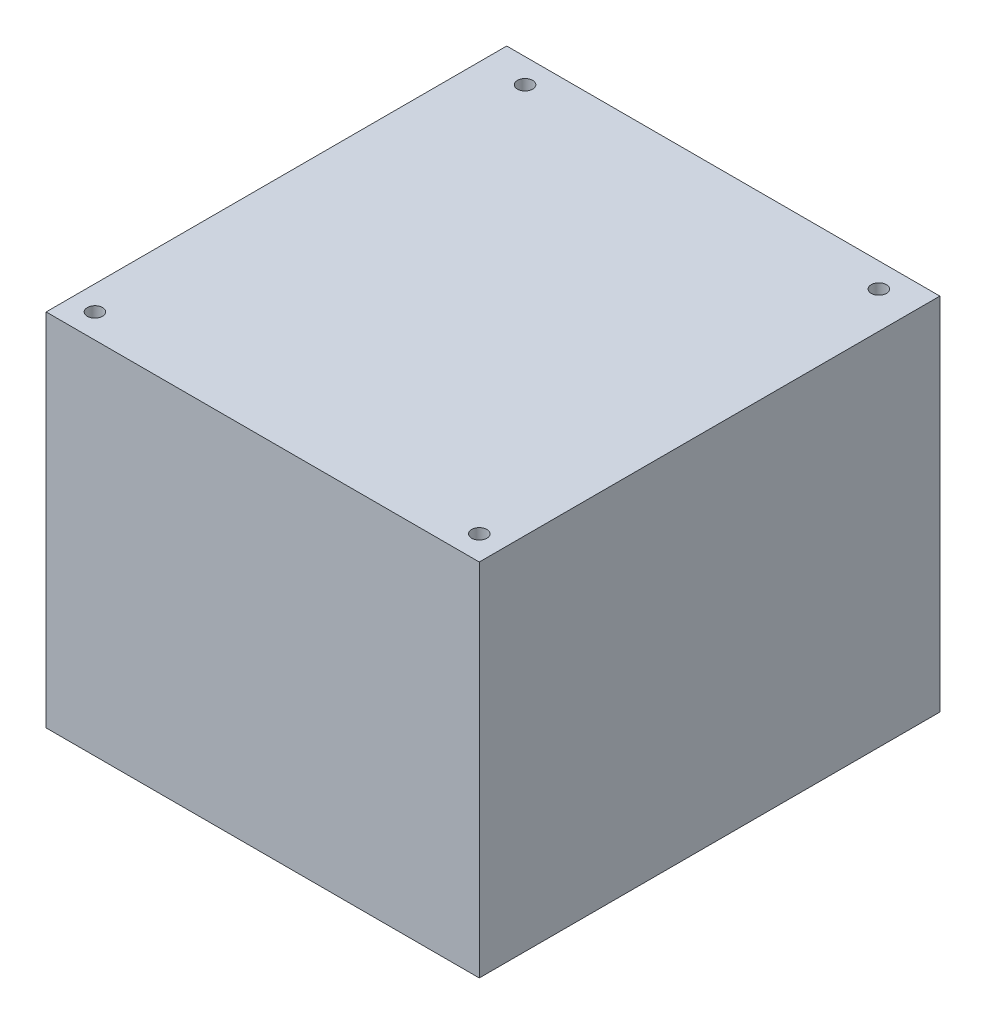
ISO-10303-21;
HEADER;
FILE_DESCRIPTION(('STEP AP214'),'2;1');
FILE_NAME('part.step','',(''),(''),'','','');
FILE_SCHEMA(('AUTOMOTIVE_DESIGN { 1 0 10303 214 1 1 1 1 }'));
ENDSEC;
DATA;
#1=APPLICATION_CONTEXT('core data for automotive mechanical design processes');
#2=APPLICATION_PROTOCOL_DEFINITION('international standard','automotive_design',2000,#1);
#3=PRODUCT_CONTEXT('',#1,'mechanical');
#4=PRODUCT('Part','Part','',(#3));
#5=PRODUCT_RELATED_PRODUCT_CATEGORY('part','',(#4));
#6=PRODUCT_DEFINITION_FORMATION('','',#4);
#7=PRODUCT_DEFINITION_CONTEXT('part definition',#1,'design');
#8=PRODUCT_DEFINITION('design','',#6,#7);
#9=PRODUCT_DEFINITION_SHAPE('','',#8);
#10=(LENGTH_UNIT() NAMED_UNIT(*) SI_UNIT(.MILLI.,.METRE.));
#11=(NAMED_UNIT(*) PLANE_ANGLE_UNIT() SI_UNIT($,.RADIAN.));
#12=(NAMED_UNIT(*) SI_UNIT($,.STERADIAN.) SOLID_ANGLE_UNIT());
#13=UNCERTAINTY_MEASURE_WITH_UNIT(LENGTH_MEASURE(1.E-05),#10,'distance_accuracy_value','');
#14=(GEOMETRIC_REPRESENTATION_CONTEXT(3) GLOBAL_UNCERTAINTY_ASSIGNED_CONTEXT((#13)) GLOBAL_UNIT_ASSIGNED_CONTEXT((#10,
#11,#12)) REPRESENTATION_CONTEXT('',''));
#15=CARTESIAN_POINT('',(0.,0.,0.));
#16=DIRECTION('',(0.,0.,1.));
#17=DIRECTION('',(1.,0.,0.));
#18=AXIS2_PLACEMENT_3D('',#15,#16,#17);
#19=CARTESIAN_POINT('',(45.085,75.,47.9425));
#20=DIRECTION('',(-1.,0.,0.));
#21=DIRECTION('',(0.,0.,1.));
#22=AXIS2_PLACEMENT_3D('',#19,#20,#21);
#23=PLANE('',#22);
#24=DIRECTION('',(0.,0.,-1.));
#25=VECTOR('',#24,1.);
#26=CARTESIAN_POINT('',(45.085,0.,47.9425));
#27=LINE('',#26,#25);
#28=CARTESIAN_POINT('',(45.085,0.,47.9425));
#29=VERTEX_POINT('',#28);
#30=CARTESIAN_POINT('',(45.085,0.,-47.9425));
#31=VERTEX_POINT('',#30);
#32=EDGE_CURVE('E96',#29,#31,#27,.T.);
#33=ORIENTED_EDGE('',*,*,#32,.T.);
#34=DIRECTION('',(0.,-1.,0.));
#35=VECTOR('',#34,1.);
#36=CARTESIAN_POINT('',(45.085,75.,-47.9425));
#37=LINE('',#36,#35);
#38=CARTESIAN_POINT('',(45.085,75.,-47.9425));
#39=VERTEX_POINT('',#38);
#40=EDGE_CURVE('E11',#39,#31,#37,.T.);
#41=ORIENTED_EDGE('',*,*,#40,.F.);
#42=DIRECTION('',(0.,0.,-1.));
#43=VECTOR('',#42,1.);
#44=CARTESIAN_POINT('',(45.085,75.,47.9425));
#45=LINE('',#44,#43);
#46=CARTESIAN_POINT('',(45.085,75.,47.9425));
#47=VERTEX_POINT('',#46);
#48=EDGE_CURVE('E84',#47,#39,#45,.T.);
#49=ORIENTED_EDGE('',*,*,#48,.F.);
#50=DIRECTION('',(0.,-1.,0.));
#51=VECTOR('',#50,1.);
#52=CARTESIAN_POINT('',(45.085,75.,47.9425));
#53=LINE('',#52,#51);
#54=EDGE_CURVE('E92',#47,#29,#53,.T.);
#55=ORIENTED_EDGE('',*,*,#54,.T.);
#56=EDGE_LOOP('',(#33,#41,#49,#55));
#57=FACE_BOUND('',#56,.T.);
#58=ADVANCED_FACE('F33',(#57),#23,.F.);
#59=CARTESIAN_POINT('',(-45.085,75.,-47.9425));
#60=DIRECTION('',(0.,0.,1.));
#61=DIRECTION('',(1.,0.,0.));
#62=AXIS2_PLACEMENT_3D('',#59,#60,#61);
#63=PLANE('',#62);
#64=DIRECTION('',(-1.,0.,0.));
#65=VECTOR('',#64,1.);
#66=CARTESIAN_POINT('',(-45.085,0.,-47.9425));
#67=LINE('',#66,#65);
#68=CARTESIAN_POINT('',(-45.085,0.,-47.9425));
#69=VERTEX_POINT('',#68);
#70=EDGE_CURVE('E88',#31,#69,#67,.T.);
#71=ORIENTED_EDGE('',*,*,#70,.T.);
#72=DIRECTION('',(0.,-1.,0.));
#73=VECTOR('',#72,1.);
#74=CARTESIAN_POINT('',(-45.085,75.,-47.9425));
#75=LINE('',#74,#73);
#76=CARTESIAN_POINT('',(-45.085,75.,-47.9425));
#77=VERTEX_POINT('',#76);
#78=EDGE_CURVE('E41',#77,#69,#75,.T.);
#79=ORIENTED_EDGE('',*,*,#78,.F.);
#80=DIRECTION('',(-1.,0.,0.));
#81=VECTOR('',#80,1.);
#82=CARTESIAN_POINT('',(-45.085,75.,-47.9425));
#83=LINE('',#82,#81);
#84=EDGE_CURVE('E79',#39,#77,#83,.T.);
#85=ORIENTED_EDGE('',*,*,#84,.F.);
#86=ORIENTED_EDGE('',*,*,#40,.T.);
#87=EDGE_LOOP('',(#71,#79,#85,#86));
#88=FACE_BOUND('',#87,.T.);
#89=ADVANCED_FACE('F87',(#88),#63,.F.);
#90=CARTESIAN_POINT('',(-45.085,75.,47.9425));
#91=DIRECTION('',(1.,0.,0.));
#92=DIRECTION('',(0.,0.,-1.));
#93=AXIS2_PLACEMENT_3D('',#90,#91,#92);
#94=PLANE('',#93);
#95=DIRECTION('',(0.,0.,1.));
#96=VECTOR('',#95,1.);
#97=CARTESIAN_POINT('',(-45.085,0.,47.9425));
#98=LINE('',#97,#96);
#99=CARTESIAN_POINT('',(-45.085,0.,47.9425));
#100=VERTEX_POINT('',#99);
#101=EDGE_CURVE('E66',#69,#100,#98,.T.);
#102=ORIENTED_EDGE('',*,*,#101,.T.);
#103=DIRECTION('',(0.,-1.,0.));
#104=VECTOR('',#103,1.);
#105=CARTESIAN_POINT('',(-45.085,75.,47.9425));
#106=LINE('',#105,#104);
#107=CARTESIAN_POINT('',(-45.085,75.,47.9425));
#108=VERTEX_POINT('',#107);
#109=EDGE_CURVE('E89',#108,#100,#106,.T.);
#110=ORIENTED_EDGE('',*,*,#109,.F.);
#111=DIRECTION('',(0.,0.,1.));
#112=VECTOR('',#111,1.);
#113=CARTESIAN_POINT('',(-45.085,75.,47.9425));
#114=LINE('',#113,#112);
#115=EDGE_CURVE('E82',#77,#108,#114,.T.);
#116=ORIENTED_EDGE('',*,*,#115,.F.);
#117=ORIENTED_EDGE('',*,*,#78,.T.);
#118=EDGE_LOOP('',(#102,#110,#116,#117));
#119=FACE_BOUND('',#118,.T.);
#120=ADVANCED_FACE('F90',(#119),#94,.F.);
#121=CARTESIAN_POINT('',(-45.085,75.,47.9425));
#122=DIRECTION('',(0.,0.,-1.));
#123=DIRECTION('',(-1.,0.,0.));
#124=AXIS2_PLACEMENT_3D('',#121,#122,#123);
#125=PLANE('',#124);
#126=DIRECTION('',(1.,0.,0.));
#127=VECTOR('',#126,1.);
#128=CARTESIAN_POINT('',(-45.085,0.,47.9425));
#129=LINE('',#128,#127);
#130=EDGE_CURVE('E72',#100,#29,#129,.T.);
#131=ORIENTED_EDGE('',*,*,#130,.T.);
#132=ORIENTED_EDGE('',*,*,#54,.F.);
#133=DIRECTION('',(1.,0.,0.));
#134=VECTOR('',#133,1.);
#135=CARTESIAN_POINT('',(-45.085,75.,47.9425));
#136=LINE('',#135,#134);
#137=EDGE_CURVE('E49',#108,#47,#136,.T.);
#138=ORIENTED_EDGE('',*,*,#137,.F.);
#139=ORIENTED_EDGE('',*,*,#109,.T.);
#140=EDGE_LOOP('',(#131,#132,#138,#139));
#141=FACE_BOUND('',#140,.T.);
#142=ADVANCED_FACE('F104',(#141),#125,.F.);
#143=CARTESIAN_POINT('',(0.,75.,0.));
#144=DIRECTION('',(0.,-1.,0.));
#145=DIRECTION('',(0.,0.,-1.));
#146=AXIS2_PLACEMENT_3D('',#143,#144,#145);
#147=PLANE('',#146);
#148=CARTESIAN_POINT('',(37.465,75.,-42.8625));
#149=DIRECTION('',(0.,1.,0.));
#150=DIRECTION('',(0.,0.,1.));
#151=AXIS2_PLACEMENT_3D('',#148,#149,#150);
#152=CIRCLE('',#151,1.5875);
#153=CARTESIAN_POINT('',(37.465,75.,-41.275));
#154=VERTEX_POINT('',#153);
#155=EDGE_CURVE('E128',#154,#154,#152,.T.);
#156=ORIENTED_EDGE('',*,*,#155,.F.);
#157=EDGE_LOOP('',(#156));
#158=FACE_BOUND('',#157,.T.);
#159=CARTESIAN_POINT('',(-36.195,75.,-42.8625));
#160=DIRECTION('',(0.,1.,0.));
#161=DIRECTION('',(0.,0.,1.));
#162=AXIS2_PLACEMENT_3D('',#159,#160,#161);
#163=CIRCLE('',#162,1.5875);
#164=CARTESIAN_POINT('',(-36.195,75.,-41.275));
#165=VERTEX_POINT('',#164);
#166=EDGE_CURVE('E122',#165,#165,#163,.T.);
#167=ORIENTED_EDGE('',*,*,#166,.F.);
#168=EDGE_LOOP('',(#167));
#169=FACE_BOUND('',#168,.T.);
#170=CARTESIAN_POINT('',(40.005,75.,42.8625));
#171=DIRECTION('',(0.,1.,0.));
#172=DIRECTION('',(0.,0.,1.));
#173=AXIS2_PLACEMENT_3D('',#170,#171,#172);
#174=CIRCLE('',#173,1.5875);
#175=CARTESIAN_POINT('',(40.005,75.,44.45));
#176=VERTEX_POINT('',#175);
#177=EDGE_CURVE('E116',#176,#176,#174,.T.);
#178=ORIENTED_EDGE('',*,*,#177,.F.);
#179=EDGE_LOOP('',(#178));
#180=FACE_BOUND('',#179,.T.);
#181=CARTESIAN_POINT('',(-40.005,75.,42.8625));
#182=DIRECTION('',(0.,1.,0.));
#183=DIRECTION('',(0.,0.,1.));
#184=AXIS2_PLACEMENT_3D('',#181,#182,#183);
#185=CIRCLE('',#184,1.5875);
#186=CARTESIAN_POINT('',(-40.005,75.,44.45));
#187=VERTEX_POINT('',#186);
#188=EDGE_CURVE('E110',#187,#187,#185,.T.);
#189=ORIENTED_EDGE('',*,*,#188,.F.);
#190=EDGE_LOOP('',(#189));
#191=FACE_BOUND('',#190,.T.);
#192=ORIENTED_EDGE('',*,*,#48,.T.);
#193=ORIENTED_EDGE('',*,*,#84,.T.);
#194=ORIENTED_EDGE('',*,*,#115,.T.);
#195=ORIENTED_EDGE('',*,*,#137,.T.);
#196=EDGE_LOOP('',(#192,#193,#194,#195));
#197=FACE_BOUND('',#196,.T.);
#198=ADVANCED_FACE('F80',(#158,#169,#180,#191,#197),#147,.F.);
#199=CARTESIAN_POINT('',(0.,0.,0.));
#200=DIRECTION('',(0.,-1.,0.));
#201=DIRECTION('',(0.,0.,-1.));
#202=AXIS2_PLACEMENT_3D('',#199,#200,#201);
#203=PLANE('',#202);
#204=CARTESIAN_POINT('',(37.465,0.,-42.8625));
#205=DIRECTION('',(0.,1.,0.));
#206=DIRECTION('',(0.,0.,1.));
#207=AXIS2_PLACEMENT_3D('',#204,#205,#206);
#208=CIRCLE('',#207,1.5875);
#209=CARTESIAN_POINT('',(37.465,0.,-41.275));
#210=VERTEX_POINT('',#209);
#211=EDGE_CURVE('E125',#210,#210,#208,.T.);
#212=ORIENTED_EDGE('',*,*,#211,.T.);
#213=EDGE_LOOP('',(#212));
#214=FACE_BOUND('',#213,.T.);
#215=CARTESIAN_POINT('',(-36.195,0.,-42.8625));
#216=DIRECTION('',(0.,1.,0.));
#217=DIRECTION('',(0.,0.,1.));
#218=AXIS2_PLACEMENT_3D('',#215,#216,#217);
#219=CIRCLE('',#218,1.5875);
#220=CARTESIAN_POINT('',(-36.195,0.,-41.275));
#221=VERTEX_POINT('',#220);
#222=EDGE_CURVE('E119',#221,#221,#219,.T.);
#223=ORIENTED_EDGE('',*,*,#222,.T.);
#224=EDGE_LOOP('',(#223));
#225=FACE_BOUND('',#224,.T.);
#226=CARTESIAN_POINT('',(40.005,0.,42.8625));
#227=DIRECTION('',(0.,1.,0.));
#228=DIRECTION('',(0.,0.,1.));
#229=AXIS2_PLACEMENT_3D('',#226,#227,#228);
#230=CIRCLE('',#229,1.5875);
#231=CARTESIAN_POINT('',(40.005,0.,44.45));
#232=VERTEX_POINT('',#231);
#233=EDGE_CURVE('E113',#232,#232,#230,.T.);
#234=ORIENTED_EDGE('',*,*,#233,.T.);
#235=EDGE_LOOP('',(#234));
#236=FACE_BOUND('',#235,.T.);
#237=CARTESIAN_POINT('',(-40.005,0.,42.8625));
#238=DIRECTION('',(0.,1.,0.));
#239=DIRECTION('',(0.,0.,1.));
#240=AXIS2_PLACEMENT_3D('',#237,#238,#239);
#241=CIRCLE('',#240,1.5875);
#242=CARTESIAN_POINT('',(-40.005,0.,44.45));
#243=VERTEX_POINT('',#242);
#244=EDGE_CURVE('E99',#243,#243,#241,.T.);
#245=ORIENTED_EDGE('',*,*,#244,.T.);
#246=EDGE_LOOP('',(#245));
#247=FACE_BOUND('',#246,.T.);
#248=ORIENTED_EDGE('',*,*,#32,.F.);
#249=ORIENTED_EDGE('',*,*,#130,.F.);
#250=ORIENTED_EDGE('',*,*,#101,.F.);
#251=ORIENTED_EDGE('',*,*,#70,.F.);
#252=EDGE_LOOP('',(#248,#249,#250,#251));
#253=FACE_BOUND('',#252,.T.);
#254=ADVANCED_FACE('F107',(#214,#225,#236,#247,#253),#203,.T.);
#255=CARTESIAN_POINT('',(-40.005,0.,42.8625));
#256=DIRECTION('',(0.,1.,0.));
#257=DIRECTION('',(0.,0.,1.));
#258=AXIS2_PLACEMENT_3D('',#255,#256,#257);
#259=CYLINDRICAL_SURFACE('',#258,1.5875);
#260=ORIENTED_EDGE('',*,*,#244,.F.);
#261=EDGE_LOOP('',(#260));
#262=FACE_BOUND('',#261,.T.);
#263=ORIENTED_EDGE('',*,*,#188,.T.);
#264=EDGE_LOOP('',(#263));
#265=FACE_BOUND('',#264,.T.);
#266=ADVANCED_FACE('F152',(#262,#265),#259,.F.);
#267=CARTESIAN_POINT('',(40.005,0.,42.8625));
#268=DIRECTION('',(0.,1.,0.));
#269=DIRECTION('',(0.,0.,1.));
#270=AXIS2_PLACEMENT_3D('',#267,#268,#269);
#271=CYLINDRICAL_SURFACE('',#270,1.5875);
#272=ORIENTED_EDGE('',*,*,#233,.F.);
#273=EDGE_LOOP('',(#272));
#274=FACE_BOUND('',#273,.T.);
#275=ORIENTED_EDGE('',*,*,#177,.T.);
#276=EDGE_LOOP('',(#275));
#277=FACE_BOUND('',#276,.T.);
#278=ADVANCED_FACE('F154',(#274,#277),#271,.F.);
#279=CARTESIAN_POINT('',(-36.195,0.,-42.8625));
#280=DIRECTION('',(0.,1.,0.));
#281=DIRECTION('',(0.,0.,1.));
#282=AXIS2_PLACEMENT_3D('',#279,#280,#281);
#283=CYLINDRICAL_SURFACE('',#282,1.5875);
#284=ORIENTED_EDGE('',*,*,#222,.F.);
#285=EDGE_LOOP('',(#284));
#286=FACE_BOUND('',#285,.T.);
#287=ORIENTED_EDGE('',*,*,#166,.T.);
#288=EDGE_LOOP('',(#287));
#289=FACE_BOUND('',#288,.T.);
#290=ADVANCED_FACE('F139',(#286,#289),#283,.F.);
#291=CARTESIAN_POINT('',(37.465,0.,-42.8625));
#292=DIRECTION('',(0.,1.,0.));
#293=DIRECTION('',(0.,0.,1.));
#294=AXIS2_PLACEMENT_3D('',#291,#292,#293);
#295=CYLINDRICAL_SURFACE('',#294,1.5875);
#296=ORIENTED_EDGE('',*,*,#211,.F.);
#297=EDGE_LOOP('',(#296));
#298=FACE_BOUND('',#297,.T.);
#299=ORIENTED_EDGE('',*,*,#155,.T.);
#300=EDGE_LOOP('',(#299));
#301=FACE_BOUND('',#300,.T.);
#302=ADVANCED_FACE('F136',(#298,#301),#295,.F.);
#303=CLOSED_SHELL('',(#58,#89,#120,#142,#198,#254,#266,#278,#290,#302));
#304=MANIFOLD_SOLID_BREP('B2',#303);
#305=ADVANCED_BREP_SHAPE_REPRESENTATION('',(#18,#304),#14);
#306=SHAPE_DEFINITION_REPRESENTATION(#9,#305);
ENDSEC;
END-ISO-10303-21;
